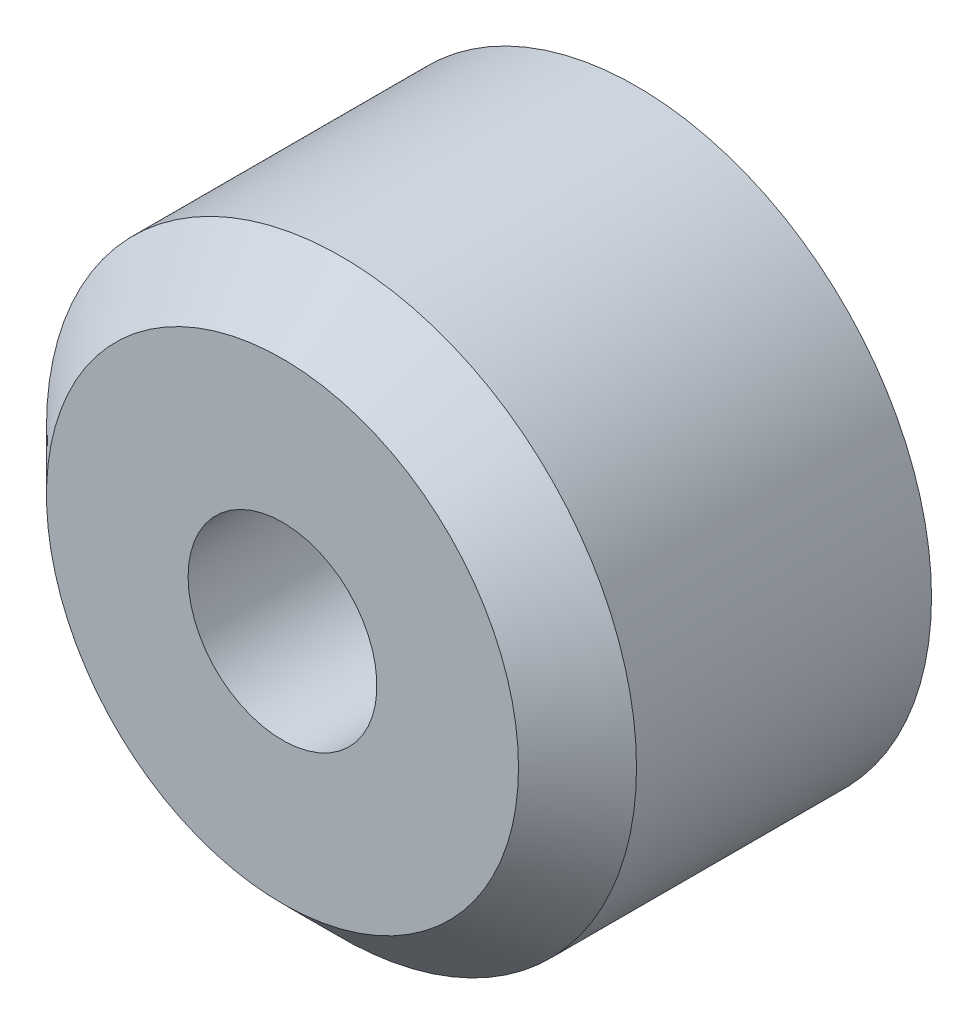
ISO-10303-21;
HEADER;
FILE_DESCRIPTION(('STEP AP214'),'2;1');
FILE_NAME('part.step','',(''),(''),'','','');
FILE_SCHEMA(('AUTOMOTIVE_DESIGN { 1 0 10303 214 1 1 1 1 }'));
ENDSEC;
DATA;
#1=APPLICATION_CONTEXT('core data for automotive mechanical design processes');
#2=APPLICATION_PROTOCOL_DEFINITION('international standard','automotive_design',2000,#1);
#3=PRODUCT_CONTEXT('',#1,'mechanical');
#4=PRODUCT('Part','Part','',(#3));
#5=PRODUCT_RELATED_PRODUCT_CATEGORY('part','',(#4));
#6=PRODUCT_DEFINITION_FORMATION('','',#4);
#7=PRODUCT_DEFINITION_CONTEXT('part definition',#1,'design');
#8=PRODUCT_DEFINITION('design','',#6,#7);
#9=PRODUCT_DEFINITION_SHAPE('','',#8);
#10=(LENGTH_UNIT() NAMED_UNIT(*) SI_UNIT(.MILLI.,.METRE.));
#11=(NAMED_UNIT(*) PLANE_ANGLE_UNIT() SI_UNIT($,.RADIAN.));
#12=(NAMED_UNIT(*) SI_UNIT($,.STERADIAN.) SOLID_ANGLE_UNIT());
#13=UNCERTAINTY_MEASURE_WITH_UNIT(LENGTH_MEASURE(1.E-05),#10,'distance_accuracy_value','');
#14=(GEOMETRIC_REPRESENTATION_CONTEXT(3) GLOBAL_UNCERTAINTY_ASSIGNED_CONTEXT((#13)) GLOBAL_UNIT_ASSIGNED_CONTEXT((#10,
#11,#12)) REPRESENTATION_CONTEXT('',''));
#15=CARTESIAN_POINT('',(0.,0.,0.));
#16=DIRECTION('',(0.,0.,1.));
#17=DIRECTION('',(1.,0.,0.));
#18=AXIS2_PLACEMENT_3D('',#15,#16,#17);
#19=CARTESIAN_POINT('',(0.,0.,6.));
#20=DIRECTION('',(0.,0.,-1.));
#21=DIRECTION('',(-1.,0.,0.));
#22=AXIS2_PLACEMENT_3D('',#19,#20,#21);
#23=CYLINDRICAL_SURFACE('',#22,5.);
#24=CARTESIAN_POINT('',(0.,0.,5.));
#25=DIRECTION('',(0.,0.,1.));
#26=DIRECTION('',(1.,0.,0.));
#27=AXIS2_PLACEMENT_3D('',#24,#25,#26);
#28=CIRCLE('',#27,5.);
#29=CARTESIAN_POINT('',(5.,0.,5.));
#30=VERTEX_POINT('',#29);
#31=EDGE_CURVE('E10',#30,#30,#28,.F.);
#32=ORIENTED_EDGE('',*,*,#31,.T.);
#33=EDGE_LOOP('',(#32));
#34=FACE_BOUND('',#33,.T.);
#35=CARTESIAN_POINT('',(0.,0.,0.));
#36=DIRECTION('',(0.,0.,1.));
#37=DIRECTION('',(1.,0.,0.));
#38=AXIS2_PLACEMENT_3D('',#35,#36,#37);
#39=CIRCLE('',#38,5.);
#40=CARTESIAN_POINT('',(5.,0.,0.));
#41=VERTEX_POINT('',#40);
#42=EDGE_CURVE('E42',#41,#41,#39,.T.);
#43=ORIENTED_EDGE('',*,*,#42,.T.);
#44=EDGE_LOOP('',(#43));
#45=FACE_BOUND('',#44,.T.);
#46=ADVANCED_FACE('F31',(#34,#45),#23,.T.);
#47=CARTESIAN_POINT('',(0.,0.,6.));
#48=DIRECTION('',(0.,0.,1.));
#49=DIRECTION('',(1.,0.,0.));
#50=AXIS2_PLACEMENT_3D('',#47,#48,#49);
#51=PLANE('',#50);
#52=CARTESIAN_POINT('',(0.,0.,6.));
#53=DIRECTION('',(0.,0.,1.));
#54=DIRECTION('',(1.,0.,0.));
#55=AXIS2_PLACEMENT_3D('',#52,#53,#54);
#56=CIRCLE('',#55,4.);
#57=CARTESIAN_POINT('',(4.,0.,6.));
#58=VERTEX_POINT('',#57);
#59=EDGE_CURVE('E38',#58,#58,#56,.T.);
#60=ORIENTED_EDGE('',*,*,#59,.T.);
#61=EDGE_LOOP('',(#60));
#62=FACE_BOUND('',#61,.T.);
#63=CARTESIAN_POINT('',(0.,0.,6.));
#64=DIRECTION('',(0.,0.,-1.));
#65=DIRECTION('',(-1.,0.,0.));
#66=AXIS2_PLACEMENT_3D('',#63,#64,#65);
#67=CIRCLE('',#66,1.6);
#68=CARTESIAN_POINT('',(-1.6,0.,6.));
#69=VERTEX_POINT('',#68);
#70=EDGE_CURVE('E46',#69,#69,#67,.T.);
#71=ORIENTED_EDGE('',*,*,#70,.T.);
#72=EDGE_LOOP('',(#71));
#73=FACE_BOUND('',#72,.T.);
#74=ADVANCED_FACE('F64',(#62,#73),#51,.T.);
#75=CARTESIAN_POINT('',(0.,0.,0.));
#76=DIRECTION('',(0.,0.,1.));
#77=DIRECTION('',(1.,0.,0.));
#78=AXIS2_PLACEMENT_3D('',#75,#76,#77);
#79=PLANE('',#78);
#80=CARTESIAN_POINT('',(0.,0.,0.));
#81=DIRECTION('',(0.,0.,-1.));
#82=DIRECTION('',(-1.,0.,0.));
#83=AXIS2_PLACEMENT_3D('',#80,#81,#82);
#84=CIRCLE('',#83,3.15);
#85=CARTESIAN_POINT('',(-3.15,0.,0.));
#86=VERTEX_POINT('',#85);
#87=EDGE_CURVE('E54',#86,#86,#84,.T.);
#88=ORIENTED_EDGE('',*,*,#87,.F.);
#89=EDGE_LOOP('',(#88));
#90=FACE_BOUND('',#89,.T.);
#91=ORIENTED_EDGE('',*,*,#42,.F.);
#92=EDGE_LOOP('',(#91));
#93=FACE_BOUND('',#92,.T.);
#94=ADVANCED_FACE('F60',(#90,#93),#79,.F.);
#95=CARTESIAN_POINT('',(0.,0.,0.));
#96=DIRECTION('',(0.,0.,-1.));
#97=DIRECTION('',(-1.,0.,0.));
#98=AXIS2_PLACEMENT_3D('',#95,#96,#97);
#99=CYLINDRICAL_SURFACE('',#98,1.59999999999999);
#100=ORIENTED_EDGE('',*,*,#70,.F.);
#101=EDGE_LOOP('',(#100));
#102=FACE_BOUND('',#101,.T.);
#103=CARTESIAN_POINT('',(0.,0.,1.55));
#104=DIRECTION('',(0.,0.,-1.));
#105=DIRECTION('',(-1.,0.,0.));
#106=AXIS2_PLACEMENT_3D('',#103,#104,#105);
#107=CIRCLE('',#106,1.59999999999999);
#108=CARTESIAN_POINT('',(-1.59999999999999,0.,1.55));
#109=VERTEX_POINT('',#108);
#110=EDGE_CURVE('E51',#109,#109,#107,.T.);
#111=ORIENTED_EDGE('',*,*,#110,.T.);
#112=EDGE_LOOP('',(#111));
#113=FACE_BOUND('',#112,.T.);
#114=ADVANCED_FACE('F63',(#102,#113),#99,.F.);
#115=CARTESIAN_POINT('',(0.,0.,0.));
#116=DIRECTION('',(0.,0.,-1.));
#117=DIRECTION('',(-1.,0.,0.));
#118=AXIS2_PLACEMENT_3D('',#115,#116,#117);
#119=CONICAL_SURFACE('',#118,3.15,0.785398163397453);
#120=ORIENTED_EDGE('',*,*,#110,.F.);
#121=EDGE_LOOP('',(#120));
#122=FACE_BOUND('',#121,.T.);
#123=ORIENTED_EDGE('',*,*,#87,.T.);
#124=EDGE_LOOP('',(#123));
#125=FACE_BOUND('',#124,.T.);
#126=ADVANCED_FACE('F58',(#122,#125),#119,.F.);
#127=CARTESIAN_POINT('',(0.,0.,6.));
#128=DIRECTION('',(0.,0.,-1.));
#129=DIRECTION('',(-1.,0.,0.));
#130=AXIS2_PLACEMENT_3D('',#127,#128,#129);
#131=CONICAL_SURFACE('',#130,4.,0.785398163397447);
#132=ORIENTED_EDGE('',*,*,#31,.F.);
#133=EDGE_LOOP('',(#132));
#134=FACE_BOUND('',#133,.T.);
#135=ORIENTED_EDGE('',*,*,#59,.F.);
#136=EDGE_LOOP('',(#135));
#137=FACE_BOUND('',#136,.T.);
#138=ADVANCED_FACE('F33',(#134,#137),#131,.T.);
#139=CLOSED_SHELL('',(#46,#74,#94,#114,#126,#138));
#140=MANIFOLD_SOLID_BREP('B2',#139);
#141=ADVANCED_BREP_SHAPE_REPRESENTATION('',(#18,#140),#14);
#142=SHAPE_DEFINITION_REPRESENTATION(#9,#141);
ENDSEC;
END-ISO-10303-21;
